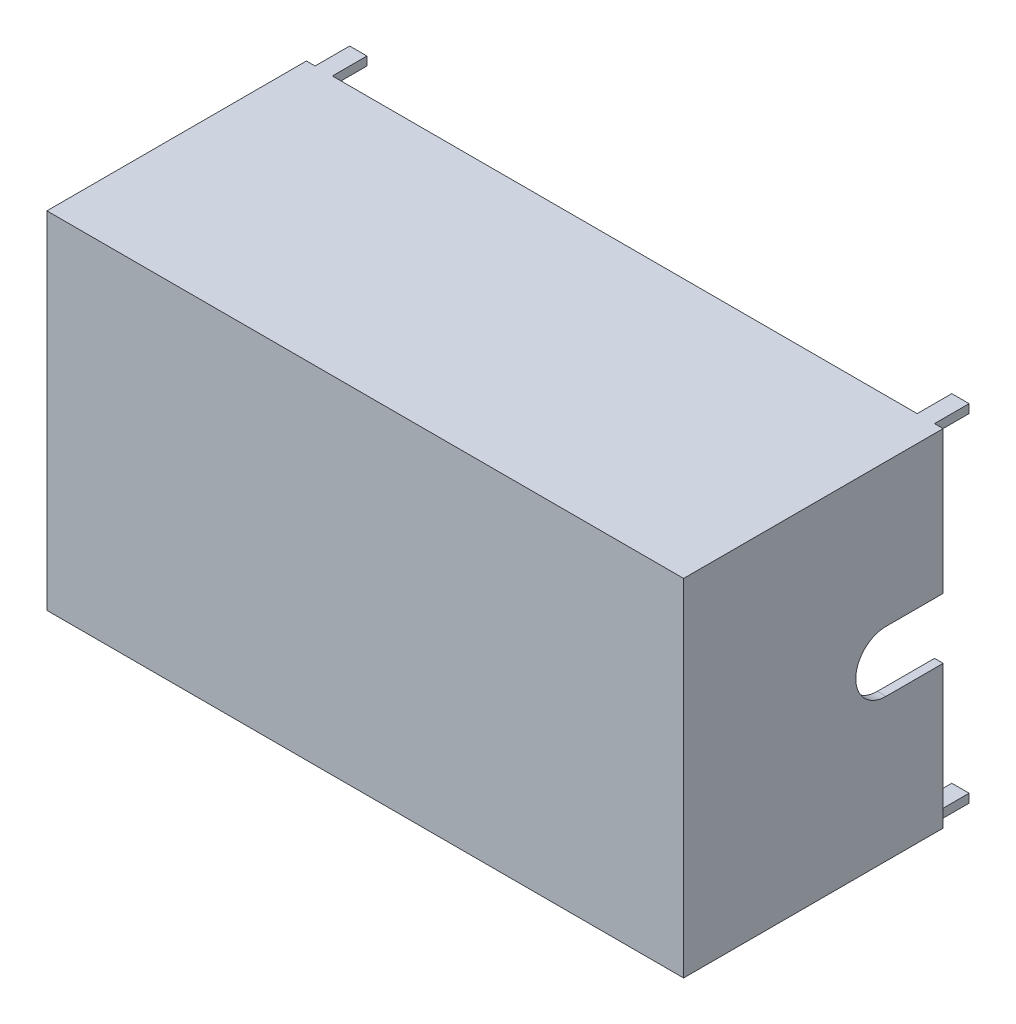
ISO-10303-21;
HEADER;
FILE_DESCRIPTION(('STEP AP214'),'2;1');
FILE_NAME('part.step','',(''),(''),'','','');
FILE_SCHEMA(('AUTOMOTIVE_DESIGN { 1 0 10303 214 1 1 1 1 }'));
ENDSEC;
DATA;
#1=APPLICATION_CONTEXT('core data for automotive mechanical design processes');
#2=APPLICATION_PROTOCOL_DEFINITION('international standard','automotive_design',2000,#1);
#3=PRODUCT_CONTEXT('',#1,'mechanical');
#4=PRODUCT('Part','Part','',(#3));
#5=PRODUCT_RELATED_PRODUCT_CATEGORY('part','',(#4));
#6=PRODUCT_DEFINITION_FORMATION('','',#4);
#7=PRODUCT_DEFINITION_CONTEXT('part definition',#1,'design');
#8=PRODUCT_DEFINITION('design','',#6,#7);
#9=PRODUCT_DEFINITION_SHAPE('','',#8);
#10=(LENGTH_UNIT() NAMED_UNIT(*) SI_UNIT(.MILLI.,.METRE.));
#11=(NAMED_UNIT(*) PLANE_ANGLE_UNIT() SI_UNIT($,.RADIAN.));
#12=(NAMED_UNIT(*) SI_UNIT($,.STERADIAN.) SOLID_ANGLE_UNIT());
#13=UNCERTAINTY_MEASURE_WITH_UNIT(LENGTH_MEASURE(1.E-05),#10,'distance_accuracy_value','');
#14=(GEOMETRIC_REPRESENTATION_CONTEXT(3) GLOBAL_UNCERTAINTY_ASSIGNED_CONTEXT((#13)) GLOBAL_UNIT_ASSIGNED_CONTEXT((#10,
#11,#12)) REPRESENTATION_CONTEXT('',''));
#15=CARTESIAN_POINT('',(0.,0.,0.));
#16=DIRECTION('',(0.,0.,1.));
#17=DIRECTION('',(1.,0.,0.));
#18=AXIS2_PLACEMENT_3D('',#15,#16,#17);
#19=CARTESIAN_POINT('',(-37.2422810904328,16.0868238558915,0.));
#20=DIRECTION('',(0.,0.,1.));
#21=DIRECTION('',(1.,0.,0.));
#22=AXIS2_PLACEMENT_3D('',#19,#20,#21);
#23=PLANE('',#22);
#24=DIRECTION('',(0.,-1.,0.));
#25=VECTOR('',#24,1.);
#26=CARTESIAN_POINT('',(-37.7422810904328,-3.91317614410872,0.));
#27=LINE('',#26,#25);
#28=CARTESIAN_POINT('',(-37.7422810904328,-3.41317614410872,0.));
#29=VERTEX_POINT('',#28);
#30=CARTESIAN_POINT('',(-37.7422810904328,-3.91317614410867,0.));
#31=VERTEX_POINT('',#30);
#32=EDGE_CURVE('E252',#29,#31,#27,.T.);
#33=ORIENTED_EDGE('',*,*,#32,.F.);
#34=DIRECTION('',(0.,1.,0.));
#35=VECTOR('',#34,1.);
#36=CARTESIAN_POINT('',(-37.7422810904328,-3.41317614410867,0.));
#37=LINE('',#36,#35);
#38=CARTESIAN_POINT('',(-37.7422810904328,4.33682385589135,0.));
#39=VERTEX_POINT('',#38);
#40=EDGE_CURVE('E243',#29,#39,#37,.T.);
#41=ORIENTED_EDGE('',*,*,#40,.T.);
#42=DIRECTION('',(1.,0.,0.));
#43=VECTOR('',#42,1.);
#44=CARTESIAN_POINT('',(-37.2422810904328,4.33682385589135,0.));
#45=LINE('',#44,#43);
#46=CARTESIAN_POINT('',(-37.2422810904328,4.33682385589134,0.));
#47=VERTEX_POINT('',#46);
#48=EDGE_CURVE('E391',#39,#47,#45,.T.);
#49=ORIENTED_EDGE('',*,*,#48,.T.);
#50=DIRECTION('',(0.,1.,0.));
#51=VECTOR('',#50,1.);
#52=CARTESIAN_POINT('',(-37.2422810904328,-3.91317614410867,0.));
#53=LINE('',#52,#51);
#54=CARTESIAN_POINT('',(-37.2422810904328,-3.91317614410867,0.));
#55=VERTEX_POINT('',#54);
#56=EDGE_CURVE('E430',#55,#47,#53,.T.);
#57=ORIENTED_EDGE('',*,*,#56,.F.);
#58=DIRECTION('',(1.,0.,0.));
#59=VECTOR('',#58,1.);
#60=CARTESIAN_POINT('',(-74.0422810904294,-3.91317614410867,0.));
#61=LINE('',#60,#59);
#62=EDGE_CURVE('E45',#31,#55,#61,.T.);
#63=ORIENTED_EDGE('',*,*,#62,.F.);
#64=EDGE_LOOP('',(#33,#41,#49,#57,#63));
#65=FACE_BOUND('',#64,.T.);
#66=ADVANCED_FACE('F30',(#65),#23,.F.);
#67=DIRECTION('',(0.,1.,0.));
#68=VECTOR('',#67,1.);
#69=CARTESIAN_POINT('',(-38.7422810904328,-3.91317614410872,0.));
#70=LINE('',#69,#68);
#71=CARTESIAN_POINT('',(-38.7422810904328,-3.91317614410867,0.));
#72=VERTEX_POINT('',#71);
#73=CARTESIAN_POINT('',(-38.7422810904328,-3.41317614410867,0.));
#74=VERTEX_POINT('',#73);
#75=EDGE_CURVE('E53',#72,#74,#70,.T.);
#76=ORIENTED_EDGE('',*,*,#75,.F.);
#77=CARTESIAN_POINT('',(-72.5422810904294,-3.91317614410867,0.));
#78=VERTEX_POINT('',#77);
#79=EDGE_CURVE('E446',#78,#72,#61,.T.);
#80=ORIENTED_EDGE('',*,*,#79,.F.);
#81=DIRECTION('',(0.,-1.,0.));
#82=VECTOR('',#81,1.);
#83=CARTESIAN_POINT('',(-72.5422810904294,-3.41317614410867,0.));
#84=LINE('',#83,#82);
#85=CARTESIAN_POINT('',(-72.5422810904294,-3.41317614410867,0.));
#86=VERTEX_POINT('',#85);
#87=EDGE_CURVE('E273',#86,#78,#84,.T.);
#88=ORIENTED_EDGE('',*,*,#87,.F.);
#89=DIRECTION('',(1.,0.,0.));
#90=VECTOR('',#89,1.);
#91=CARTESIAN_POINT('',(-73.5422810904294,-3.41317614410867,0.));
#92=LINE('',#91,#90);
#93=EDGE_CURVE('E410',#86,#74,#92,.T.);
#94=ORIENTED_EDGE('',*,*,#93,.T.);
#95=EDGE_LOOP('',(#76,#80,#88,#94));
#96=FACE_BOUND('',#95,.T.);
#97=ADVANCED_FACE('F543',(#96),#23,.F.);
#98=DIRECTION('',(0.,1.,0.));
#99=VECTOR('',#98,1.);
#100=CARTESIAN_POINT('',(-73.5422810904294,-3.41317614410867,0.));
#101=LINE('',#100,#99);
#102=CARTESIAN_POINT('',(-73.5422810904294,-3.91317614410867,0.));
#103=VERTEX_POINT('',#102);
#104=CARTESIAN_POINT('',(-73.5422810904294,-3.41317614410867,0.));
#105=VERTEX_POINT('',#104);
#106=EDGE_CURVE('E276',#103,#105,#101,.T.);
#107=ORIENTED_EDGE('',*,*,#106,.F.);
#108=CARTESIAN_POINT('',(-74.0422810904294,-3.91317614410867,0.));
#109=VERTEX_POINT('',#108);
#110=EDGE_CURVE('E442',#109,#103,#61,.T.);
#111=ORIENTED_EDGE('',*,*,#110,.F.);
#112=DIRECTION('',(0.,-1.,0.));
#113=VECTOR('',#112,1.);
#114=CARTESIAN_POINT('',(-74.0422810904294,16.0868238558915,0.));
#115=LINE('',#114,#113);
#116=CARTESIAN_POINT('',(-74.0422810904294,4.33682385589137,0.));
#117=VERTEX_POINT('',#116);
#118=EDGE_CURVE('E437',#117,#109,#115,.T.);
#119=ORIENTED_EDGE('',*,*,#118,.F.);
#120=CARTESIAN_POINT('',(-73.5422810904294,4.33682385589137,0.));
#121=VERTEX_POINT('',#120);
#122=EDGE_CURVE('E388',#117,#121,#45,.T.);
#123=ORIENTED_EDGE('',*,*,#122,.T.);
#124=DIRECTION('',(0.,-1.,0.));
#125=VECTOR('',#124,1.);
#126=CARTESIAN_POINT('',(-73.5422810904294,15.5868238558915,0.));
#127=LINE('',#126,#125);
#128=EDGE_CURVE('E406',#121,#105,#127,.T.);
#129=ORIENTED_EDGE('',*,*,#128,.T.);
#130=EDGE_LOOP('',(#107,#111,#119,#123,#129));
#131=FACE_BOUND('',#130,.T.);
#132=ADVANCED_FACE('F472',(#131),#23,.F.);
#133=DIRECTION('',(0.,1.,0.));
#134=VECTOR('',#133,1.);
#135=CARTESIAN_POINT('',(-73.5422810904294,15.5868238558915,0.));
#136=LINE('',#135,#134);
#137=CARTESIAN_POINT('',(-73.5422810904294,15.5868238558915,0.));
#138=VERTEX_POINT('',#137);
#139=CARTESIAN_POINT('',(-73.5422810904294,16.0868238558915,0.));
#140=VERTEX_POINT('',#139);
#141=EDGE_CURVE('E300',#138,#140,#136,.T.);
#142=ORIENTED_EDGE('',*,*,#141,.F.);
#143=CARTESIAN_POINT('',(-73.5422810904294,7.83682385589137,0.));
#144=VERTEX_POINT('',#143);
#145=EDGE_CURVE('E407',#138,#144,#127,.T.);
#146=ORIENTED_EDGE('',*,*,#145,.T.);
#147=DIRECTION('',(-1.,0.,0.));
#148=VECTOR('',#147,1.);
#149=CARTESIAN_POINT('',(-37.2422810904328,7.83682385589134,0.));
#150=LINE('',#149,#148);
#151=CARTESIAN_POINT('',(-74.0422810904294,7.83682385589137,0.));
#152=VERTEX_POINT('',#151);
#153=EDGE_CURVE('E375',#144,#152,#150,.T.);
#154=ORIENTED_EDGE('',*,*,#153,.T.);
#155=CARTESIAN_POINT('',(-74.0422810904294,16.0868238558915,0.));
#156=VERTEX_POINT('',#155);
#157=EDGE_CURVE('E439',#156,#152,#115,.T.);
#158=ORIENTED_EDGE('',*,*,#157,.F.);
#159=DIRECTION('',(-1.,0.,0.));
#160=VECTOR('',#159,1.);
#161=CARTESIAN_POINT('',(-37.2422810904328,16.0868238558915,0.));
#162=LINE('',#161,#160);
#163=EDGE_CURVE('E433',#140,#156,#162,.T.);
#164=ORIENTED_EDGE('',*,*,#163,.F.);
#165=EDGE_LOOP('',(#142,#146,#154,#158,#164));
#166=FACE_BOUND('',#165,.T.);
#167=ADVANCED_FACE('F482',(#166),#23,.F.);
#168=DIRECTION('',(0.,-1.,0.));
#169=VECTOR('',#168,1.);
#170=CARTESIAN_POINT('',(-72.5422810904294,15.5868238558915,0.));
#171=LINE('',#170,#169);
#172=CARTESIAN_POINT('',(-72.5422810904294,16.0868238558915,0.));
#173=VERTEX_POINT('',#172);
#174=CARTESIAN_POINT('',(-72.5422810904294,15.5868238558915,0.));
#175=VERTEX_POINT('',#174);
#176=EDGE_CURVE('E303',#173,#175,#171,.T.);
#177=ORIENTED_EDGE('',*,*,#176,.F.);
#178=CARTESIAN_POINT('',(-38.7422810904328,16.0868238558915,0.));
#179=VERTEX_POINT('',#178);
#180=EDGE_CURVE('E438',#179,#173,#162,.T.);
#181=ORIENTED_EDGE('',*,*,#180,.F.);
#182=DIRECTION('',(0.,1.,0.));
#183=VECTOR('',#182,1.);
#184=CARTESIAN_POINT('',(-38.7422810904328,16.0868238558915,0.));
#185=LINE('',#184,#183);
#186=CARTESIAN_POINT('',(-38.7422810904328,15.5868238558915,0.));
#187=VERTEX_POINT('',#186);
#188=EDGE_CURVE('E327',#187,#179,#185,.T.);
#189=ORIENTED_EDGE('',*,*,#188,.F.);
#190=DIRECTION('',(-1.,0.,0.));
#191=VECTOR('',#190,1.);
#192=CARTESIAN_POINT('',(-37.7422810904328,15.5868238558915,0.));
#193=LINE('',#192,#191);
#194=EDGE_CURVE('E248',#187,#175,#193,.T.);
#195=ORIENTED_EDGE('',*,*,#194,.T.);
#196=EDGE_LOOP('',(#177,#181,#189,#195));
#197=FACE_BOUND('',#196,.T.);
#198=ADVANCED_FACE('F586',(#197),#23,.F.);
#199=DIRECTION('',(0.,-1.,0.));
#200=VECTOR('',#199,1.);
#201=CARTESIAN_POINT('',(-37.7422810904328,16.0868238558915,0.));
#202=LINE('',#201,#200);
#203=CARTESIAN_POINT('',(-37.7422810904328,16.0868238558915,0.));
#204=VERTEX_POINT('',#203);
#205=CARTESIAN_POINT('',(-37.7422810904328,15.5868238558915,0.));
#206=VERTEX_POINT('',#205);
#207=EDGE_CURVE('E330',#204,#206,#202,.T.);
#208=ORIENTED_EDGE('',*,*,#207,.F.);
#209=CARTESIAN_POINT('',(-37.2422810904328,16.0868238558915,0.));
#210=VERTEX_POINT('',#209);
#211=EDGE_CURVE('E434',#210,#204,#162,.T.);
#212=ORIENTED_EDGE('',*,*,#211,.F.);
#213=CARTESIAN_POINT('',(-37.2422810904328,7.83682385589134,0.));
#214=VERTEX_POINT('',#213);
#215=EDGE_CURVE('E429',#214,#210,#53,.T.);
#216=ORIENTED_EDGE('',*,*,#215,.F.);
#217=CARTESIAN_POINT('',(-37.7422810904328,7.83682385589134,0.));
#218=VERTEX_POINT('',#217);
#219=EDGE_CURVE('E383',#214,#218,#150,.T.);
#220=ORIENTED_EDGE('',*,*,#219,.T.);
#221=EDGE_CURVE('E249',#218,#206,#37,.T.);
#222=ORIENTED_EDGE('',*,*,#221,.T.);
#223=EDGE_LOOP('',(#208,#212,#216,#220,#222));
#224=FACE_BOUND('',#223,.T.);
#225=ADVANCED_FACE('F510',(#224),#23,.F.);
#226=CARTESIAN_POINT('',(-37.2422810904328,-3.91317614410867,14.));
#227=DIRECTION('',(-1.,0.,0.));
#228=DIRECTION('',(0.,0.,1.));
#229=AXIS2_PLACEMENT_3D('',#226,#227,#228);
#230=PLANE('',#229);
#231=ORIENTED_EDGE('',*,*,#56,.T.);
#232=DIRECTION('',(0.,0.,-1.));
#233=VECTOR('',#232,1.);
#234=CARTESIAN_POINT('',(-37.2422810904328,4.33682385589134,3.30000000000089));
#235=LINE('',#234,#233);
#236=CARTESIAN_POINT('',(-37.2422810904328,4.33682385589134,3.30000000000089));
#237=VERTEX_POINT('',#236);
#238=EDGE_CURVE('E354',#237,#47,#235,.T.);
#239=ORIENTED_EDGE('',*,*,#238,.F.);
#240=CARTESIAN_POINT('',(-37.2422810904328,6.08682385589134,3.30000000000089));
#241=DIRECTION('',(1.,0.,0.));
#242=DIRECTION('',(0.,1.,0.));
#243=AXIS2_PLACEMENT_3D('',#240,#241,#242);
#244=CIRCLE('',#243,1.75);
#245=CARTESIAN_POINT('',(-37.2422810904328,7.83682385589134,3.30000000000089));
#246=VERTEX_POINT('',#245);
#247=EDGE_CURVE('E359',#246,#237,#244,.T.);
#248=ORIENTED_EDGE('',*,*,#247,.F.);
#249=DIRECTION('',(0.,0.,1.));
#250=VECTOR('',#249,1.);
#251=CARTESIAN_POINT('',(-37.2422810904328,7.83682385589134,3.30000000000089));
#252=LINE('',#251,#250);
#253=EDGE_CURVE('E356',#214,#246,#252,.T.);
#254=ORIENTED_EDGE('',*,*,#253,.F.);
#255=ORIENTED_EDGE('',*,*,#215,.T.);
#256=DIRECTION('',(0.,0.,-1.));
#257=VECTOR('',#256,1.);
#258=CARTESIAN_POINT('',(-37.2422810904328,16.0868238558915,14.));
#259=LINE('',#258,#257);
#260=CARTESIAN_POINT('',(-37.2422810904328,16.0868238558915,15.));
#261=VERTEX_POINT('',#260);
#262=EDGE_CURVE('E455',#261,#210,#259,.T.);
#263=ORIENTED_EDGE('',*,*,#262,.F.);
#264=DIRECTION('',(0.,1.,0.));
#265=VECTOR('',#264,1.);
#266=CARTESIAN_POINT('',(-37.2422810904328,-3.91317614410867,15.));
#267=LINE('',#266,#265);
#268=CARTESIAN_POINT('',(-37.2422810904328,-3.91317614410867,15.));
#269=VERTEX_POINT('',#268);
#270=EDGE_CURVE('E396',#269,#261,#267,.T.);
#271=ORIENTED_EDGE('',*,*,#270,.F.);
#272=DIRECTION('',(0.,0.,-1.));
#273=VECTOR('',#272,1.);
#274=CARTESIAN_POINT('',(-37.2422810904328,-3.91317614410867,14.));
#275=LINE('',#274,#273);
#276=EDGE_CURVE('E445',#269,#55,#275,.T.);
#277=ORIENTED_EDGE('',*,*,#276,.T.);
#278=EDGE_LOOP('',(#231,#239,#248,#254,#255,#263,#271,#277));
#279=FACE_BOUND('',#278,.T.);
#280=ADVANCED_FACE('F32',(#279),#230,.F.);
#281=CARTESIAN_POINT('',(-37.2422810904328,16.0868238558915,14.));
#282=DIRECTION('',(0.,-1.,0.));
#283=DIRECTION('',(0.,0.,-1.));
#284=AXIS2_PLACEMENT_3D('',#281,#282,#283);
#285=PLANE('',#284);
#286=ORIENTED_EDGE('',*,*,#211,.T.);
#287=DIRECTION('',(0.,0.,1.));
#288=VECTOR('',#287,1.);
#289=CARTESIAN_POINT('',(-37.7422810904328,16.0868238558915,-2.));
#290=LINE('',#289,#288);
#291=CARTESIAN_POINT('',(-37.7422810904328,16.0868238558915,-2.));
#292=VERTEX_POINT('',#291);
#293=EDGE_CURVE('E345',#292,#204,#290,.T.);
#294=ORIENTED_EDGE('',*,*,#293,.F.);
#295=DIRECTION('',(1.,0.,0.));
#296=VECTOR('',#295,1.);
#297=CARTESIAN_POINT('',(-37.7422810904328,16.0868238558915,-2.));
#298=LINE('',#297,#296);
#299=CARTESIAN_POINT('',(-38.7422810904328,16.0868238558915,-2.));
#300=VERTEX_POINT('',#299);
#301=EDGE_CURVE('E338',#300,#292,#298,.T.);
#302=ORIENTED_EDGE('',*,*,#301,.F.);
#303=DIRECTION('',(0.,0.,1.));
#304=VECTOR('',#303,1.);
#305=CARTESIAN_POINT('',(-38.7422810904328,16.0868238558915,-2.));
#306=LINE('',#305,#304);
#307=EDGE_CURVE('E348',#300,#179,#306,.T.);
#308=ORIENTED_EDGE('',*,*,#307,.T.);
#309=ORIENTED_EDGE('',*,*,#180,.T.);
#310=DIRECTION('',(0.,0.,1.));
#311=VECTOR('',#310,1.);
#312=CARTESIAN_POINT('',(-72.5422810904294,16.0868238558915,-2.));
#313=LINE('',#312,#311);
#314=CARTESIAN_POINT('',(-72.5422810904294,16.0868238558915,-2.));
#315=VERTEX_POINT('',#314);
#316=EDGE_CURVE('E318',#315,#173,#313,.T.);
#317=ORIENTED_EDGE('',*,*,#316,.F.);
#318=DIRECTION('',(1.,0.,0.));
#319=VECTOR('',#318,1.);
#320=CARTESIAN_POINT('',(-72.5422810904294,16.0868238558915,-2.));
#321=LINE('',#320,#319);
#322=CARTESIAN_POINT('',(-73.5422810904294,16.0868238558915,-2.));
#323=VERTEX_POINT('',#322);
#324=EDGE_CURVE('E311',#323,#315,#321,.T.);
#325=ORIENTED_EDGE('',*,*,#324,.F.);
#326=DIRECTION('',(0.,0.,1.));
#327=VECTOR('',#326,1.);
#328=CARTESIAN_POINT('',(-73.5422810904294,16.0868238558915,-2.));
#329=LINE('',#328,#327);
#330=EDGE_CURVE('E321',#323,#140,#329,.T.);
#331=ORIENTED_EDGE('',*,*,#330,.T.);
#332=ORIENTED_EDGE('',*,*,#163,.T.);
#333=DIRECTION('',(0.,0.,-1.));
#334=VECTOR('',#333,1.);
#335=CARTESIAN_POINT('',(-74.0422810904294,16.0868238558915,14.));
#336=LINE('',#335,#334);
#337=CARTESIAN_POINT('',(-74.0422810904294,16.0868238558915,15.));
#338=VERTEX_POINT('',#337);
#339=EDGE_CURVE('E452',#338,#156,#336,.T.);
#340=ORIENTED_EDGE('',*,*,#339,.F.);
#341=DIRECTION('',(-1.,0.,0.));
#342=VECTOR('',#341,1.);
#343=CARTESIAN_POINT('',(-37.2422810904328,16.0868238558915,15.));
#344=LINE('',#343,#342);
#345=EDGE_CURVE('E399',#261,#338,#344,.T.);
#346=ORIENTED_EDGE('',*,*,#345,.F.);
#347=ORIENTED_EDGE('',*,*,#262,.T.);
#348=EDGE_LOOP('',(#286,#294,#302,#308,#309,#317,#325,#331,#332,#340,#346,#347));
#349=FACE_BOUND('',#348,.T.);
#350=ADVANCED_FACE('F507',(#349),#285,.F.);
#351=CARTESIAN_POINT('',(-74.0422810904294,16.0868238558915,14.));
#352=DIRECTION('',(1.,0.,0.));
#353=DIRECTION('',(0.,0.,-1.));
#354=AXIS2_PLACEMENT_3D('',#351,#352,#353);
#355=PLANE('',#354);
#356=CARTESIAN_POINT('',(-74.0422810904294,6.08682385589137,3.30000000000089));
#357=DIRECTION('',(1.,0.,0.));
#358=DIRECTION('',(0.,1.,0.));
#359=AXIS2_PLACEMENT_3D('',#356,#357,#358);
#360=CIRCLE('',#359,1.75);
#361=CARTESIAN_POINT('',(-74.0422810904294,7.83682385589137,3.30000000000089));
#362=VERTEX_POINT('',#361);
#363=CARTESIAN_POINT('',(-74.0422810904294,4.33682385589137,3.30000000000089));
#364=VERTEX_POINT('',#363);
#365=EDGE_CURVE('E368',#362,#364,#360,.T.);
#366=ORIENTED_EDGE('',*,*,#365,.T.);
#367=DIRECTION('',(0.,0.,-1.));
#368=VECTOR('',#367,1.);
#369=CARTESIAN_POINT('',(-74.0422810904294,4.33682385589137,3.30000000000089));
#370=LINE('',#369,#368);
#371=EDGE_CURVE('E362',#364,#117,#370,.T.);
#372=ORIENTED_EDGE('',*,*,#371,.T.);
#373=ORIENTED_EDGE('',*,*,#118,.T.);
#374=DIRECTION('',(0.,0.,-1.));
#375=VECTOR('',#374,1.);
#376=CARTESIAN_POINT('',(-74.0422810904294,-3.91317614410867,14.));
#377=LINE('',#376,#375);
#378=CARTESIAN_POINT('',(-74.0422810904294,-3.91317614410867,15.));
#379=VERTEX_POINT('',#378);
#380=EDGE_CURVE('E449',#379,#109,#377,.T.);
#381=ORIENTED_EDGE('',*,*,#380,.F.);
#382=DIRECTION('',(0.,-1.,0.));
#383=VECTOR('',#382,1.);
#384=CARTESIAN_POINT('',(-74.0422810904294,16.0868238558915,15.));
#385=LINE('',#384,#383);
#386=EDGE_CURVE('E402',#338,#379,#385,.T.);
#387=ORIENTED_EDGE('',*,*,#386,.F.);
#388=ORIENTED_EDGE('',*,*,#339,.T.);
#389=ORIENTED_EDGE('',*,*,#157,.T.);
#390=DIRECTION('',(0.,0.,1.));
#391=VECTOR('',#390,1.);
#392=CARTESIAN_POINT('',(-74.0422810904294,7.83682385589137,3.30000000000089));
#393=LINE('',#392,#391);
#394=EDGE_CURVE('E365',#152,#362,#393,.T.);
#395=ORIENTED_EDGE('',*,*,#394,.T.);
#396=EDGE_LOOP('',(#366,#372,#373,#381,#387,#388,#389,#395));
#397=FACE_BOUND('',#396,.T.);
#398=ADVANCED_FACE('F476',(#397),#355,.F.);
#399=CARTESIAN_POINT('',(-74.0422810904294,-3.91317614410867,14.));
#400=DIRECTION('',(0.,1.,0.));
#401=DIRECTION('',(0.,0.,1.));
#402=AXIS2_PLACEMENT_3D('',#399,#400,#401);
#403=PLANE('',#402);
#404=ORIENTED_EDGE('',*,*,#110,.T.);
#405=DIRECTION('',(0.,0.,1.));
#406=VECTOR('',#405,1.);
#407=CARTESIAN_POINT('',(-73.5422810904294,-3.91317614410867,-2.));
#408=LINE('',#407,#406);
#409=CARTESIAN_POINT('',(-73.5422810904294,-3.91317614410867,-2.));
#410=VERTEX_POINT('',#409);
#411=EDGE_CURVE('E291',#410,#103,#408,.T.);
#412=ORIENTED_EDGE('',*,*,#411,.F.);
#413=DIRECTION('',(-1.,0.,0.));
#414=VECTOR('',#413,1.);
#415=CARTESIAN_POINT('',(-72.5422810904294,-3.91317614410867,-2.));
#416=LINE('',#415,#414);
#417=CARTESIAN_POINT('',(-72.5422810904294,-3.91317614410867,-2.));
#418=VERTEX_POINT('',#417);
#419=EDGE_CURVE('E284',#418,#410,#416,.T.);
#420=ORIENTED_EDGE('',*,*,#419,.F.);
#421=DIRECTION('',(0.,0.,1.));
#422=VECTOR('',#421,1.);
#423=CARTESIAN_POINT('',(-72.5422810904294,-3.91317614410867,-2.));
#424=LINE('',#423,#422);
#425=EDGE_CURVE('E294',#418,#78,#424,.T.);
#426=ORIENTED_EDGE('',*,*,#425,.T.);
#427=ORIENTED_EDGE('',*,*,#79,.T.);
#428=DIRECTION('',(0.,0.,1.));
#429=VECTOR('',#428,1.);
#430=CARTESIAN_POINT('',(-38.7422810904328,-3.91317614410872,-2.));
#431=LINE('',#430,#429);
#432=CARTESIAN_POINT('',(-38.7422810904328,-3.91317614410872,-2.));
#433=VERTEX_POINT('',#432);
#434=EDGE_CURVE('E263',#433,#72,#431,.T.);
#435=ORIENTED_EDGE('',*,*,#434,.F.);
#436=DIRECTION('',(-1.,0.,0.));
#437=VECTOR('',#436,1.);
#438=CARTESIAN_POINT('',(-37.7422810904328,-3.91317614410872,-2.));
#439=LINE('',#438,#437);
#440=CARTESIAN_POINT('',(-37.7422810904328,-3.91317614410872,-2.));
#441=VERTEX_POINT('',#440);
#442=EDGE_CURVE('E536',#441,#433,#439,.T.);
#443=ORIENTED_EDGE('',*,*,#442,.F.);
#444=DIRECTION('',(0.,0.,1.));
#445=VECTOR('',#444,1.);
#446=CARTESIAN_POINT('',(-37.7422810904328,-3.91317614410872,-2.));
#447=LINE('',#446,#445);
#448=EDGE_CURVE('E271',#441,#31,#447,.T.);
#449=ORIENTED_EDGE('',*,*,#448,.T.);
#450=ORIENTED_EDGE('',*,*,#62,.T.);
#451=ORIENTED_EDGE('',*,*,#276,.F.);
#452=DIRECTION('',(1.,0.,0.));
#453=VECTOR('',#452,1.);
#454=CARTESIAN_POINT('',(-74.0422810904294,-3.91317614410867,15.));
#455=LINE('',#454,#453);
#456=EDGE_CURVE('E393',#379,#269,#455,.T.);
#457=ORIENTED_EDGE('',*,*,#456,.F.);
#458=ORIENTED_EDGE('',*,*,#380,.T.);
#459=EDGE_LOOP('',(#404,#412,#420,#426,#427,#435,#443,#449,#450,#451,#457,#458));
#460=FACE_BOUND('',#459,.T.);
#461=ADVANCED_FACE('F526',(#460),#403,.F.);
#462=CARTESIAN_POINT('',(-37.7422810904328,-3.41317614410867,14.));
#463=DIRECTION('',(-1.,0.,0.));
#464=DIRECTION('',(0.,0.,1.));
#465=AXIS2_PLACEMENT_3D('',#462,#463,#464);
#466=PLANE('',#465);
#467=DIRECTION('',(0.,0.,1.));
#468=VECTOR('',#467,1.);
#469=CARTESIAN_POINT('',(-37.7422810904328,4.33682385589135,14.));
#470=LINE('',#469,#468);
#471=CARTESIAN_POINT('',(-37.7422810904328,4.33682385589135,3.30000000000089));
#472=VERTEX_POINT('',#471);
#473=EDGE_CURVE('E246',#39,#472,#470,.T.);
#474=ORIENTED_EDGE('',*,*,#473,.F.);
#475=ORIENTED_EDGE('',*,*,#40,.F.);
#476=DIRECTION('',(0.,0.,-1.));
#477=VECTOR('',#476,1.);
#478=CARTESIAN_POINT('',(-37.7422810904328,-3.41317614410867,14.));
#479=LINE('',#478,#477);
#480=CARTESIAN_POINT('',(-37.7422810904328,-3.41317614410867,14.));
#481=VERTEX_POINT('',#480);
#482=EDGE_CURVE('E228',#481,#29,#479,.T.);
#483=ORIENTED_EDGE('',*,*,#482,.F.);
#484=DIRECTION('',(0.,1.,0.));
#485=VECTOR('',#484,1.);
#486=CARTESIAN_POINT('',(-37.7422810904328,-3.41317614410867,14.));
#487=LINE('',#486,#485);
#488=CARTESIAN_POINT('',(-37.7422810904328,15.5868238558915,14.));
#489=VERTEX_POINT('',#488);
#490=EDGE_CURVE('E412',#481,#489,#487,.T.);
#491=ORIENTED_EDGE('',*,*,#490,.T.);
#492=DIRECTION('',(0.,0.,-1.));
#493=VECTOR('',#492,1.);
#494=CARTESIAN_POINT('',(-37.7422810904328,15.5868238558915,14.));
#495=LINE('',#494,#493);
#496=EDGE_CURVE('E426',#489,#206,#495,.T.);
#497=ORIENTED_EDGE('',*,*,#496,.T.);
#498=ORIENTED_EDGE('',*,*,#221,.F.);
#499=DIRECTION('',(0.,0.,-1.));
#500=VECTOR('',#499,1.);
#501=CARTESIAN_POINT('',(-37.7422810904328,7.83682385589134,14.));
#502=LINE('',#501,#500);
#503=CARTESIAN_POINT('',(-37.7422810904328,7.83682385589134,3.30000000000089));
#504=VERTEX_POINT('',#503);
#505=EDGE_CURVE('E382',#504,#218,#502,.T.);
#506=ORIENTED_EDGE('',*,*,#505,.F.);
#507=CARTESIAN_POINT('',(-37.7422810904328,6.08682385589134,3.30000000000089));
#508=DIRECTION('',(-1.,0.,0.));
#509=DIRECTION('',(0.,0.,1.));
#510=AXIS2_PLACEMENT_3D('',#507,#508,#509);
#511=CIRCLE('',#510,1.75);
#512=EDGE_CURVE('E385',#472,#504,#511,.T.);
#513=ORIENTED_EDGE('',*,*,#512,.F.);
#514=EDGE_LOOP('',(#474,#475,#483,#491,#497,#498,#506,#513));
#515=FACE_BOUND('',#514,.T.);
#516=ADVANCED_FACE('F244',(#515),#466,.T.);
#517=CARTESIAN_POINT('',(-37.7422810904328,15.5868238558915,14.));
#518=DIRECTION('',(0.,-1.,0.));
#519=DIRECTION('',(0.,0.,-1.));
#520=AXIS2_PLACEMENT_3D('',#517,#518,#519);
#521=PLANE('',#520);
#522=ORIENTED_EDGE('',*,*,#194,.F.);
#523=DIRECTION('',(0.,0.,1.));
#524=VECTOR('',#523,1.);
#525=CARTESIAN_POINT('',(-38.7422810904328,15.5868238558915,-2.));
#526=LINE('',#525,#524);
#527=CARTESIAN_POINT('',(-38.7422810904328,15.5868238558915,-2.));
#528=VERTEX_POINT('',#527);
#529=EDGE_CURVE('E351',#528,#187,#526,.T.);
#530=ORIENTED_EDGE('',*,*,#529,.F.);
#531=DIRECTION('',(-1.,0.,0.));
#532=VECTOR('',#531,1.);
#533=CARTESIAN_POINT('',(-37.7422810904328,15.5868238558915,-2.));
#534=LINE('',#533,#532);
#535=CARTESIAN_POINT('',(-37.7422810904328,15.5868238558915,-2.));
#536=VERTEX_POINT('',#535);
#537=EDGE_CURVE('E333',#536,#528,#534,.T.);
#538=ORIENTED_EDGE('',*,*,#537,.F.);
#539=DIRECTION('',(0.,0.,1.));
#540=VECTOR('',#539,1.);
#541=CARTESIAN_POINT('',(-37.7422810904328,15.5868238558915,-2.));
#542=LINE('',#541,#540);
#543=EDGE_CURVE('E342',#536,#206,#542,.T.);
#544=ORIENTED_EDGE('',*,*,#543,.T.);
#545=ORIENTED_EDGE('',*,*,#496,.F.);
#546=DIRECTION('',(-1.,0.,0.));
#547=VECTOR('',#546,1.);
#548=CARTESIAN_POINT('',(-37.7422810904328,15.5868238558915,14.));
#549=LINE('',#548,#547);
#550=CARTESIAN_POINT('',(-73.5422810904294,15.5868238558915,14.));
#551=VERTEX_POINT('',#550);
#552=EDGE_CURVE('E414',#489,#551,#549,.T.);
#553=ORIENTED_EDGE('',*,*,#552,.T.);
#554=DIRECTION('',(0.,0.,-1.));
#555=VECTOR('',#554,1.);
#556=CARTESIAN_POINT('',(-73.5422810904294,15.5868238558915,14.));
#557=LINE('',#556,#555);
#558=EDGE_CURVE('E423',#551,#138,#557,.T.);
#559=ORIENTED_EDGE('',*,*,#558,.T.);
#560=DIRECTION('',(0.,0.,1.));
#561=VECTOR('',#560,1.);
#562=CARTESIAN_POINT('',(-73.5422810904294,15.5868238558915,-2.));
#563=LINE('',#562,#561);
#564=CARTESIAN_POINT('',(-73.5422810904294,15.5868238558915,-2.));
#565=VERTEX_POINT('',#564);
#566=EDGE_CURVE('E324',#565,#138,#563,.T.);
#567=ORIENTED_EDGE('',*,*,#566,.F.);
#568=DIRECTION('',(-1.,0.,0.));
#569=VECTOR('',#568,1.);
#570=CARTESIAN_POINT('',(-72.5422810904294,15.5868238558915,-2.));
#571=LINE('',#570,#569);
#572=CARTESIAN_POINT('',(-72.5422810904294,15.5868238558915,-2.));
#573=VERTEX_POINT('',#572);
#574=EDGE_CURVE('E306',#573,#565,#571,.T.);
#575=ORIENTED_EDGE('',*,*,#574,.F.);
#576=DIRECTION('',(0.,0.,1.));
#577=VECTOR('',#576,1.);
#578=CARTESIAN_POINT('',(-72.5422810904294,15.5868238558915,-2.));
#579=LINE('',#578,#577);
#580=EDGE_CURVE('E315',#573,#175,#579,.T.);
#581=ORIENTED_EDGE('',*,*,#580,.T.);
#582=EDGE_LOOP('',(#522,#530,#538,#544,#545,#553,#559,#567,#575,#581));
#583=FACE_BOUND('',#582,.T.);
#584=ADVANCED_FACE('F486',(#583),#521,.T.);
#585=CARTESIAN_POINT('',(-73.5422810904294,15.5868238558915,14.));
#586=DIRECTION('',(1.,0.,0.));
#587=DIRECTION('',(0.,0.,-1.));
#588=AXIS2_PLACEMENT_3D('',#585,#586,#587);
#589=PLANE('',#588);
#590=DIRECTION('',(0.,0.,-1.));
#591=VECTOR('',#590,1.);
#592=CARTESIAN_POINT('',(-73.5422810904294,4.33682385589137,14.));
#593=LINE('',#592,#591);
#594=CARTESIAN_POINT('',(-73.5422810904294,4.33682385589137,3.30000000000089));
#595=VERTEX_POINT('',#594);
#596=EDGE_CURVE('E11',#595,#121,#593,.T.);
#597=ORIENTED_EDGE('',*,*,#596,.F.);
#598=CARTESIAN_POINT('',(-73.5422810904294,6.08682385589137,3.30000000000089));
#599=DIRECTION('',(1.,0.,0.));
#600=DIRECTION('',(0.,0.,-1.));
#601=AXIS2_PLACEMENT_3D('',#598,#599,#600);
#602=CIRCLE('',#601,1.75);
#603=CARTESIAN_POINT('',(-73.5422810904294,7.83682385589137,3.30000000000089));
#604=VERTEX_POINT('',#603);
#605=EDGE_CURVE('E38',#604,#595,#602,.T.);
#606=ORIENTED_EDGE('',*,*,#605,.F.);
#607=DIRECTION('',(0.,0.,1.));
#608=VECTOR('',#607,1.);
#609=CARTESIAN_POINT('',(-73.5422810904294,7.83682385589137,14.));
#610=LINE('',#609,#608);
#611=EDGE_CURVE('E458',#144,#604,#610,.T.);
#612=ORIENTED_EDGE('',*,*,#611,.F.);
#613=ORIENTED_EDGE('',*,*,#145,.F.);
#614=ORIENTED_EDGE('',*,*,#558,.F.);
#615=DIRECTION('',(0.,-1.,0.));
#616=VECTOR('',#615,1.);
#617=CARTESIAN_POINT('',(-73.5422810904294,15.5868238558915,14.));
#618=LINE('',#617,#616);
#619=CARTESIAN_POINT('',(-73.5422810904294,-3.41317614410867,14.));
#620=VERTEX_POINT('',#619);
#621=EDGE_CURVE('E417',#551,#620,#618,.T.);
#622=ORIENTED_EDGE('',*,*,#621,.T.);
#623=DIRECTION('',(0.,0.,-1.));
#624=VECTOR('',#623,1.);
#625=CARTESIAN_POINT('',(-73.5422810904294,-3.41317614410867,14.));
#626=LINE('',#625,#624);
#627=EDGE_CURVE('E239',#620,#105,#626,.T.);
#628=ORIENTED_EDGE('',*,*,#627,.T.);
#629=ORIENTED_EDGE('',*,*,#128,.F.);
#630=EDGE_LOOP('',(#597,#606,#612,#613,#614,#622,#628,#629));
#631=FACE_BOUND('',#630,.T.);
#632=ADVANCED_FACE('F470',(#631),#589,.T.);
#633=CARTESIAN_POINT('',(-73.5422810904294,-3.41317614410867,14.));
#634=DIRECTION('',(0.,1.,0.));
#635=DIRECTION('',(0.,0.,1.));
#636=AXIS2_PLACEMENT_3D('',#633,#634,#635);
#637=PLANE('',#636);
#638=ORIENTED_EDGE('',*,*,#93,.F.);
#639=DIRECTION('',(0.,0.,1.));
#640=VECTOR('',#639,1.);
#641=CARTESIAN_POINT('',(-72.5422810904294,-3.41317614410867,-2.));
#642=LINE('',#641,#640);
#643=CARTESIAN_POINT('',(-72.5422810904294,-3.41317614410867,-2.));
#644=VERTEX_POINT('',#643);
#645=EDGE_CURVE('E297',#644,#86,#642,.T.);
#646=ORIENTED_EDGE('',*,*,#645,.F.);
#647=DIRECTION('',(1.,0.,0.));
#648=VECTOR('',#647,1.);
#649=CARTESIAN_POINT('',(-72.5422810904294,-3.41317614410867,-2.));
#650=LINE('',#649,#648);
#651=CARTESIAN_POINT('',(-73.5422810904294,-3.41317614410867,-2.));
#652=VERTEX_POINT('',#651);
#653=EDGE_CURVE('E279',#652,#644,#650,.T.);
#654=ORIENTED_EDGE('',*,*,#653,.F.);
#655=DIRECTION('',(0.,0.,1.));
#656=VECTOR('',#655,1.);
#657=CARTESIAN_POINT('',(-73.5422810904294,-3.41317614410867,-2.));
#658=LINE('',#657,#656);
#659=EDGE_CURVE('E288',#652,#105,#658,.T.);
#660=ORIENTED_EDGE('',*,*,#659,.T.);
#661=ORIENTED_EDGE('',*,*,#627,.F.);
#662=DIRECTION('',(1.,0.,0.));
#663=VECTOR('',#662,1.);
#664=CARTESIAN_POINT('',(-73.5422810904294,-3.41317614410867,14.));
#665=LINE('',#664,#663);
#666=EDGE_CURVE('E236',#620,#481,#665,.T.);
#667=ORIENTED_EDGE('',*,*,#666,.T.);
#668=ORIENTED_EDGE('',*,*,#482,.T.);
#669=DIRECTION('',(0.,0.,1.));
#670=VECTOR('',#669,1.);
#671=CARTESIAN_POINT('',(-37.7422810904328,-3.41317614410872,-2.));
#672=LINE('',#671,#670);
#673=CARTESIAN_POINT('',(-37.7422810904328,-3.41317614410872,-2.));
#674=VERTEX_POINT('',#673);
#675=EDGE_CURVE('E233',#674,#29,#672,.T.);
#676=ORIENTED_EDGE('',*,*,#675,.F.);
#677=DIRECTION('',(1.,0.,0.));
#678=VECTOR('',#677,1.);
#679=CARTESIAN_POINT('',(-37.7422810904328,-3.41317614410872,-2.));
#680=LINE('',#679,#678);
#681=CARTESIAN_POINT('',(-38.7422810904328,-3.41317614410872,-2.));
#682=VERTEX_POINT('',#681);
#683=EDGE_CURVE('E260',#682,#674,#680,.T.);
#684=ORIENTED_EDGE('',*,*,#683,.F.);
#685=DIRECTION('',(0.,0.,1.));
#686=VECTOR('',#685,1.);
#687=CARTESIAN_POINT('',(-38.7422810904328,-3.41317614410872,-2.));
#688=LINE('',#687,#686);
#689=EDGE_CURVE('E259',#682,#74,#688,.T.);
#690=ORIENTED_EDGE('',*,*,#689,.T.);
#691=EDGE_LOOP('',(#638,#646,#654,#660,#661,#667,#668,#676,#684,#690));
#692=FACE_BOUND('',#691,.T.);
#693=ADVANCED_FACE('F230',(#692),#637,.T.);
#694=CARTESIAN_POINT('',(-37.2422810904328,-3.91317614410867,14.));
#695=DIRECTION('',(0.,0.,1.));
#696=DIRECTION('',(1.,0.,0.));
#697=AXIS2_PLACEMENT_3D('',#694,#695,#696);
#698=PLANE('',#697);
#699=ORIENTED_EDGE('',*,*,#490,.F.);
#700=ORIENTED_EDGE('',*,*,#666,.F.);
#701=ORIENTED_EDGE('',*,*,#621,.F.);
#702=ORIENTED_EDGE('',*,*,#552,.F.);
#703=EDGE_LOOP('',(#699,#700,#701,#702));
#704=FACE_BOUND('',#703,.T.);
#705=ADVANCED_FACE('F490',(#704),#698,.F.);
#706=CARTESIAN_POINT('',(-37.2422810904328,-3.91317614410867,15.));
#707=DIRECTION('',(0.,0.,1.));
#708=DIRECTION('',(1.,0.,0.));
#709=AXIS2_PLACEMENT_3D('',#706,#707,#708);
#710=PLANE('',#709);
#711=ORIENTED_EDGE('',*,*,#456,.T.);
#712=ORIENTED_EDGE('',*,*,#270,.T.);
#713=ORIENTED_EDGE('',*,*,#345,.T.);
#714=ORIENTED_EDGE('',*,*,#386,.T.);
#715=EDGE_LOOP('',(#711,#712,#713,#714));
#716=FACE_BOUND('',#715,.T.);
#717=ADVANCED_FACE('F555',(#716),#710,.T.);
#718=CARTESIAN_POINT('',(-74.0422810904294,7.83682385589137,3.30000000000089));
#719=DIRECTION('',(0.,1.,0.));
#720=DIRECTION('',(-1.,0.,0.));
#721=AXIS2_PLACEMENT_3D('',#718,#719,#720);
#722=PLANE('',#721);
#723=ORIENTED_EDGE('',*,*,#611,.T.);
#724=DIRECTION('',(1.,0.,0.));
#725=VECTOR('',#724,1.);
#726=CARTESIAN_POINT('',(-74.0422810904294,7.83682385589137,3.30000000000089));
#727=LINE('',#726,#725);
#728=EDGE_CURVE('E377',#362,#604,#727,.T.);
#729=ORIENTED_EDGE('',*,*,#728,.F.);
#730=ORIENTED_EDGE('',*,*,#394,.F.);
#731=ORIENTED_EDGE('',*,*,#153,.F.);
#732=EDGE_LOOP('',(#723,#729,#730,#731));
#733=FACE_BOUND('',#732,.T.);
#734=ADVANCED_FACE('F479',(#733),#722,.F.);
#735=CARTESIAN_POINT('',(-74.0422810904294,6.08682385589137,3.30000000000089));
#736=DIRECTION('',(1.,0.,0.));
#737=DIRECTION('',(0.,1.,0.));
#738=AXIS2_PLACEMENT_3D('',#735,#736,#737);
#739=CYLINDRICAL_SURFACE('',#738,1.75);
#740=ORIENTED_EDGE('',*,*,#605,.T.);
#741=DIRECTION('',(1.,0.,0.));
#742=VECTOR('',#741,1.);
#743=CARTESIAN_POINT('',(-74.0422810904294,4.33682385589137,3.30000000000089));
#744=LINE('',#743,#742);
#745=EDGE_CURVE('E372',#364,#595,#744,.T.);
#746=ORIENTED_EDGE('',*,*,#745,.F.);
#747=ORIENTED_EDGE('',*,*,#365,.F.);
#748=ORIENTED_EDGE('',*,*,#728,.T.);
#749=EDGE_LOOP('',(#740,#746,#747,#748));
#750=FACE_BOUND('',#749,.T.);
#751=ADVANCED_FACE('F461',(#750),#739,.F.);
#752=CARTESIAN_POINT('',(-74.0422810904294,4.33682385589137,3.30000000000089));
#753=DIRECTION('',(0.,-1.,0.));
#754=DIRECTION('',(1.,0.,0.));
#755=AXIS2_PLACEMENT_3D('',#752,#753,#754);
#756=PLANE('',#755);
#757=ORIENTED_EDGE('',*,*,#371,.F.);
#758=ORIENTED_EDGE('',*,*,#745,.T.);
#759=ORIENTED_EDGE('',*,*,#596,.T.);
#760=ORIENTED_EDGE('',*,*,#122,.F.);
#761=EDGE_LOOP('',(#757,#758,#759,#760));
#762=FACE_BOUND('',#761,.T.);
#763=ADVANCED_FACE('F468',(#762),#756,.F.);
#764=ORIENTED_EDGE('',*,*,#473,.T.);
#765=EDGE_CURVE('E376',#472,#237,#744,.T.);
#766=ORIENTED_EDGE('',*,*,#765,.T.);
#767=ORIENTED_EDGE('',*,*,#238,.T.);
#768=ORIENTED_EDGE('',*,*,#48,.F.);
#769=EDGE_LOOP('',(#764,#766,#767,#768));
#770=FACE_BOUND('',#769,.T.);
#771=ADVANCED_FACE('F523',(#770),#756,.F.);
#772=ORIENTED_EDGE('',*,*,#512,.T.);
#773=EDGE_CURVE('E371',#504,#246,#727,.T.);
#774=ORIENTED_EDGE('',*,*,#773,.T.);
#775=ORIENTED_EDGE('',*,*,#247,.T.);
#776=ORIENTED_EDGE('',*,*,#765,.F.);
#777=EDGE_LOOP('',(#772,#774,#775,#776));
#778=FACE_BOUND('',#777,.T.);
#779=ADVANCED_FACE('F521',(#778),#739,.F.);
#780=ORIENTED_EDGE('',*,*,#253,.T.);
#781=ORIENTED_EDGE('',*,*,#773,.F.);
#782=ORIENTED_EDGE('',*,*,#505,.T.);
#783=ORIENTED_EDGE('',*,*,#219,.F.);
#784=EDGE_LOOP('',(#780,#781,#782,#783));
#785=FACE_BOUND('',#784,.T.);
#786=ADVANCED_FACE('F518',(#785),#722,.F.);
#787=CARTESIAN_POINT('',(-38.7422810904328,16.0868238558915,-2.));
#788=DIRECTION('',(1.,0.,0.));
#789=DIRECTION('',(0.,0.,-1.));
#790=AXIS2_PLACEMENT_3D('',#787,#788,#789);
#791=PLANE('',#790);
#792=ORIENTED_EDGE('',*,*,#188,.T.);
#793=ORIENTED_EDGE('',*,*,#307,.F.);
#794=DIRECTION('',(0.,1.,0.));
#795=VECTOR('',#794,1.);
#796=CARTESIAN_POINT('',(-38.7422810904328,16.0868238558915,-2.));
#797=LINE('',#796,#795);
#798=EDGE_CURVE('E336',#528,#300,#797,.T.);
#799=ORIENTED_EDGE('',*,*,#798,.F.);
#800=ORIENTED_EDGE('',*,*,#529,.T.);
#801=EDGE_LOOP('',(#792,#793,#799,#800));
#802=FACE_BOUND('',#801,.T.);
#803=ADVANCED_FACE('F623',(#802),#791,.F.);
#804=CARTESIAN_POINT('',(-37.7422810904328,16.0868238558915,-2.));
#805=DIRECTION('',(-1.,0.,0.));
#806=DIRECTION('',(0.,0.,1.));
#807=AXIS2_PLACEMENT_3D('',#804,#805,#806);
#808=PLANE('',#807);
#809=ORIENTED_EDGE('',*,*,#207,.T.);
#810=ORIENTED_EDGE('',*,*,#543,.F.);
#811=DIRECTION('',(0.,-1.,0.));
#812=VECTOR('',#811,1.);
#813=CARTESIAN_POINT('',(-37.7422810904328,16.0868238558915,-2.));
#814=LINE('',#813,#812);
#815=EDGE_CURVE('E340',#292,#536,#814,.T.);
#816=ORIENTED_EDGE('',*,*,#815,.F.);
#817=ORIENTED_EDGE('',*,*,#293,.T.);
#818=EDGE_LOOP('',(#809,#810,#816,#817));
#819=FACE_BOUND('',#818,.T.);
#820=ADVANCED_FACE('F495',(#819),#808,.F.);
#821=CARTESIAN_POINT('',(-38.7422810904328,15.5868238558915,-2.));
#822=DIRECTION('',(0.,0.,1.));
#823=DIRECTION('',(1.,0.,0.));
#824=AXIS2_PLACEMENT_3D('',#821,#822,#823);
#825=PLANE('',#824);
#826=ORIENTED_EDGE('',*,*,#537,.T.);
#827=ORIENTED_EDGE('',*,*,#798,.T.);
#828=ORIENTED_EDGE('',*,*,#301,.T.);
#829=ORIENTED_EDGE('',*,*,#815,.T.);
#830=EDGE_LOOP('',(#826,#827,#828,#829));
#831=FACE_BOUND('',#830,.T.);
#832=ADVANCED_FACE('F503',(#831),#825,.F.);
#833=CARTESIAN_POINT('',(-73.5422810904294,15.5868238558915,-2.));
#834=DIRECTION('',(1.,0.,0.));
#835=DIRECTION('',(0.,0.,-1.));
#836=AXIS2_PLACEMENT_3D('',#833,#834,#835);
#837=PLANE('',#836);
#838=ORIENTED_EDGE('',*,*,#141,.T.);
#839=ORIENTED_EDGE('',*,*,#330,.F.);
#840=DIRECTION('',(0.,1.,0.));
#841=VECTOR('',#840,1.);
#842=CARTESIAN_POINT('',(-73.5422810904294,15.5868238558915,-2.));
#843=LINE('',#842,#841);
#844=EDGE_CURVE('E309',#565,#323,#843,.T.);
#845=ORIENTED_EDGE('',*,*,#844,.F.);
#846=ORIENTED_EDGE('',*,*,#566,.T.);
#847=EDGE_LOOP('',(#838,#839,#845,#846));
#848=FACE_BOUND('',#847,.T.);
#849=ADVANCED_FACE('F569',(#848),#837,.F.);
#850=CARTESIAN_POINT('',(-72.5422810904294,15.5868238558915,-2.));
#851=DIRECTION('',(-1.,0.,0.));
#852=DIRECTION('',(0.,0.,1.));
#853=AXIS2_PLACEMENT_3D('',#850,#851,#852);
#854=PLANE('',#853);
#855=ORIENTED_EDGE('',*,*,#176,.T.);
#856=ORIENTED_EDGE('',*,*,#580,.F.);
#857=DIRECTION('',(0.,-1.,0.));
#858=VECTOR('',#857,1.);
#859=CARTESIAN_POINT('',(-72.5422810904294,15.5868238558915,-2.));
#860=LINE('',#859,#858);
#861=EDGE_CURVE('E313',#315,#573,#860,.T.);
#862=ORIENTED_EDGE('',*,*,#861,.F.);
#863=ORIENTED_EDGE('',*,*,#316,.T.);
#864=EDGE_LOOP('',(#855,#856,#862,#863));
#865=FACE_BOUND('',#864,.T.);
#866=ADVANCED_FACE('F564',(#865),#854,.F.);
#867=CARTESIAN_POINT('',(-73.5422810904294,15.5868238558915,-2.));
#868=DIRECTION('',(0.,0.,-1.));
#869=DIRECTION('',(-1.,0.,0.));
#870=AXIS2_PLACEMENT_3D('',#867,#868,#869);
#871=PLANE('',#870);
#872=ORIENTED_EDGE('',*,*,#574,.T.);
#873=ORIENTED_EDGE('',*,*,#844,.T.);
#874=ORIENTED_EDGE('',*,*,#324,.T.);
#875=ORIENTED_EDGE('',*,*,#861,.T.);
#876=EDGE_LOOP('',(#872,#873,#874,#875));
#877=FACE_BOUND('',#876,.T.);
#878=ADVANCED_FACE('F567',(#877),#871,.T.);
#879=CARTESIAN_POINT('',(-72.5422810904294,-3.41317614410867,-2.));
#880=DIRECTION('',(-1.,0.,0.));
#881=DIRECTION('',(0.,0.,1.));
#882=AXIS2_PLACEMENT_3D('',#879,#880,#881);
#883=PLANE('',#882);
#884=ORIENTED_EDGE('',*,*,#87,.T.);
#885=ORIENTED_EDGE('',*,*,#425,.F.);
#886=DIRECTION('',(0.,-1.,0.));
#887=VECTOR('',#886,1.);
#888=CARTESIAN_POINT('',(-72.5422810904294,-3.41317614410867,-2.));
#889=LINE('',#888,#887);
#890=EDGE_CURVE('E282',#644,#418,#889,.T.);
#891=ORIENTED_EDGE('',*,*,#890,.F.);
#892=ORIENTED_EDGE('',*,*,#645,.T.);
#893=EDGE_LOOP('',(#884,#885,#891,#892));
#894=FACE_BOUND('',#893,.T.);
#895=ADVANCED_FACE('F545',(#894),#883,.F.);
#896=CARTESIAN_POINT('',(-73.5422810904294,-3.41317614410867,-2.));
#897=DIRECTION('',(1.,0.,0.));
#898=DIRECTION('',(0.,0.,-1.));
#899=AXIS2_PLACEMENT_3D('',#896,#897,#898);
#900=PLANE('',#899);
#901=ORIENTED_EDGE('',*,*,#106,.T.);
#902=ORIENTED_EDGE('',*,*,#659,.F.);
#903=DIRECTION('',(0.,1.,0.));
#904=VECTOR('',#903,1.);
#905=CARTESIAN_POINT('',(-73.5422810904294,-3.41317614410867,-2.));
#906=LINE('',#905,#904);
#907=EDGE_CURVE('E286',#410,#652,#906,.T.);
#908=ORIENTED_EDGE('',*,*,#907,.F.);
#909=ORIENTED_EDGE('',*,*,#411,.T.);
#910=EDGE_LOOP('',(#901,#902,#908,#909));
#911=FACE_BOUND('',#910,.T.);
#912=ADVANCED_FACE('F551',(#911),#900,.F.);
#913=CARTESIAN_POINT('',(-73.5422810904294,-3.41317614410867,-2.));
#914=DIRECTION('',(0.,0.,1.));
#915=DIRECTION('',(1.,0.,0.));
#916=AXIS2_PLACEMENT_3D('',#913,#914,#915);
#917=PLANE('',#916);
#918=ORIENTED_EDGE('',*,*,#653,.T.);
#919=ORIENTED_EDGE('',*,*,#890,.T.);
#920=ORIENTED_EDGE('',*,*,#419,.T.);
#921=ORIENTED_EDGE('',*,*,#907,.T.);
#922=EDGE_LOOP('',(#918,#919,#920,#921));
#923=FACE_BOUND('',#922,.T.);
#924=ADVANCED_FACE('F547',(#923),#917,.F.);
#925=CARTESIAN_POINT('',(-37.7422810904328,-3.91317614410872,-2.));
#926=DIRECTION('',(-1.,0.,0.));
#927=DIRECTION('',(0.,0.,1.));
#928=AXIS2_PLACEMENT_3D('',#925,#926,#927);
#929=PLANE('',#928);
#930=ORIENTED_EDGE('',*,*,#32,.T.);
#931=ORIENTED_EDGE('',*,*,#448,.F.);
#932=DIRECTION('',(0.,-1.,0.));
#933=VECTOR('',#932,1.);
#934=CARTESIAN_POINT('',(-37.7422810904328,-3.91317614410872,-2.));
#935=LINE('',#934,#933);
#936=EDGE_CURVE('E258',#674,#441,#935,.T.);
#937=ORIENTED_EDGE('',*,*,#936,.F.);
#938=ORIENTED_EDGE('',*,*,#675,.T.);
#939=EDGE_LOOP('',(#930,#931,#937,#938));
#940=FACE_BOUND('',#939,.T.);
#941=ADVANCED_FACE('F256',(#940),#929,.F.);
#942=CARTESIAN_POINT('',(-38.7422810904328,-3.91317614410872,-2.));
#943=DIRECTION('',(1.,0.,0.));
#944=DIRECTION('',(0.,0.,-1.));
#945=AXIS2_PLACEMENT_3D('',#942,#943,#944);
#946=PLANE('',#945);
#947=ORIENTED_EDGE('',*,*,#75,.T.);
#948=ORIENTED_EDGE('',*,*,#689,.F.);
#949=DIRECTION('',(0.,1.,0.));
#950=VECTOR('',#949,1.);
#951=CARTESIAN_POINT('',(-38.7422810904328,-3.91317614410872,-2.));
#952=LINE('',#951,#950);
#953=EDGE_CURVE('E265',#433,#682,#952,.T.);
#954=ORIENTED_EDGE('',*,*,#953,.F.);
#955=ORIENTED_EDGE('',*,*,#434,.T.);
#956=EDGE_LOOP('',(#947,#948,#954,#955));
#957=FACE_BOUND('',#956,.T.);
#958=ADVANCED_FACE('F533',(#957),#946,.F.);
#959=CARTESIAN_POINT('',(-37.7422810904328,-3.41317614410872,-2.));
#960=DIRECTION('',(0.,0.,1.));
#961=DIRECTION('',(1.,0.,0.));
#962=AXIS2_PLACEMENT_3D('',#959,#960,#961);
#963=PLANE('',#962);
#964=ORIENTED_EDGE('',*,*,#936,.T.);
#965=ORIENTED_EDGE('',*,*,#442,.T.);
#966=ORIENTED_EDGE('',*,*,#953,.T.);
#967=ORIENTED_EDGE('',*,*,#683,.T.);
#968=EDGE_LOOP('',(#964,#965,#966,#967));
#969=FACE_BOUND('',#968,.T.);
#970=ADVANCED_FACE('F540',(#969),#963,.F.);
#971=CLOSED_SHELL('',(#66,#97,#132,#167,#198,#225,#280,#350,#398,#461,#516,#584,#632,#693,#705,
#717,#734,#751,#763,#771,#779,#786,#803,#820,#832,#849,#866,#878,#895,#912,#924,#941,#958,#970));
#972=MANIFOLD_SOLID_BREP('B2',#971);
#973=ADVANCED_BREP_SHAPE_REPRESENTATION('',(#18,#972),#14);
#974=SHAPE_DEFINITION_REPRESENTATION(#9,#973);
ENDSEC;
END-ISO-10303-21;
